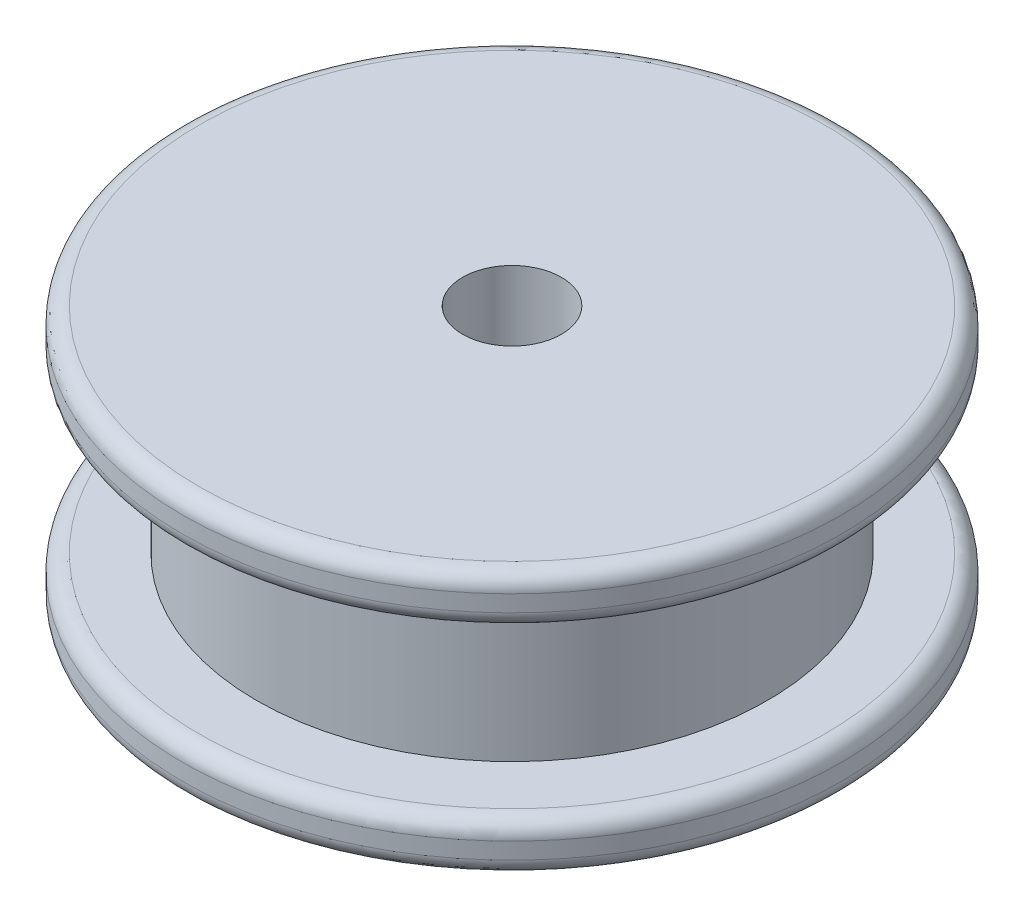
ISO-10303-21;
HEADER;
FILE_DESCRIPTION(('STEP AP214'),'2;1');
FILE_NAME('part.step','',(''),(''),'','','');
FILE_SCHEMA(('AUTOMOTIVE_DESIGN { 1 0 10303 214 1 1 1 1 }'));
ENDSEC;
DATA;
#1=APPLICATION_CONTEXT('core data for automotive mechanical design processes');
#2=APPLICATION_PROTOCOL_DEFINITION('international standard','automotive_design',2000,#1);
#3=PRODUCT_CONTEXT('',#1,'mechanical');
#4=PRODUCT('Part','Part','',(#3));
#5=PRODUCT_RELATED_PRODUCT_CATEGORY('part','',(#4));
#6=PRODUCT_DEFINITION_FORMATION('','',#4);
#7=PRODUCT_DEFINITION_CONTEXT('part definition',#1,'design');
#8=PRODUCT_DEFINITION('design','',#6,#7);
#9=PRODUCT_DEFINITION_SHAPE('','',#8);
#10=(LENGTH_UNIT() NAMED_UNIT(*) SI_UNIT(.MILLI.,.METRE.));
#11=(NAMED_UNIT(*) PLANE_ANGLE_UNIT() SI_UNIT($,.RADIAN.));
#12=(NAMED_UNIT(*) SI_UNIT($,.STERADIAN.) SOLID_ANGLE_UNIT());
#13=UNCERTAINTY_MEASURE_WITH_UNIT(LENGTH_MEASURE(1.E-05),#10,'distance_accuracy_value','');
#14=(GEOMETRIC_REPRESENTATION_CONTEXT(3) GLOBAL_UNCERTAINTY_ASSIGNED_CONTEXT((#13)) GLOBAL_UNIT_ASSIGNED_CONTEXT((#10,
#11,#12)) REPRESENTATION_CONTEXT('',''));
#15=CARTESIAN_POINT('',(0.,0.,0.));
#16=DIRECTION('',(0.,0.,1.));
#17=DIRECTION('',(1.,0.,0.));
#18=AXIS2_PLACEMENT_3D('',#15,#16,#17);
#19=CARTESIAN_POINT('',(0.,10.,0.));
#20=DIRECTION('',(0.,-1.,0.));
#21=DIRECTION('',(0.,0.,-1.));
#22=AXIS2_PLACEMENT_3D('',#19,#20,#21);
#23=CYLINDRICAL_SURFACE('',#22,15.5);
#24=CARTESIAN_POINT('',(0.,10.,0.));
#25=DIRECTION('',(0.,1.,0.));
#26=DIRECTION('',(0.,0.,1.));
#27=AXIS2_PLACEMENT_3D('',#24,#25,#26);
#28=CIRCLE('',#27,15.5);
#29=CARTESIAN_POINT('',(0.,10.,15.5));
#30=VERTEX_POINT('',#29);
#31=EDGE_CURVE('E77',#30,#30,#28,.T.);
#32=ORIENTED_EDGE('',*,*,#31,.F.);
#33=EDGE_LOOP('',(#32));
#34=FACE_BOUND('',#33,.T.);
#35=CARTESIAN_POINT('',(0.,0.,0.));
#36=DIRECTION('',(0.,1.,0.));
#37=DIRECTION('',(0.,0.,1.));
#38=AXIS2_PLACEMENT_3D('',#35,#36,#37);
#39=CIRCLE('',#38,15.5);
#40=CARTESIAN_POINT('',(0.,0.,15.5));
#41=VERTEX_POINT('',#40);
#42=EDGE_CURVE('E78',#41,#41,#39,.T.);
#43=ORIENTED_EDGE('',*,*,#42,.T.);
#44=EDGE_LOOP('',(#43));
#45=FACE_BOUND('',#44,.T.);
#46=ADVANCED_FACE('F37',(#34,#45),#23,.T.);
#47=CARTESIAN_POINT('',(0.,13.,0.));
#48=DIRECTION('',(0.,-1.,0.));
#49=DIRECTION('',(0.,0.,-1.));
#50=AXIS2_PLACEMENT_3D('',#47,#48,#49);
#51=CYLINDRICAL_SURFACE('',#50,20.);
#52=CARTESIAN_POINT('',(0.,11.,0.));
#53=DIRECTION('',(0.,1.,0.));
#54=DIRECTION('',(0.,0.,1.));
#55=AXIS2_PLACEMENT_3D('',#52,#53,#54);
#56=CIRCLE('',#55,20.);
#57=CARTESIAN_POINT('',(0.,11.,20.));
#58=VERTEX_POINT('',#57);
#59=EDGE_CURVE('E50',#58,#58,#56,.T.);
#60=ORIENTED_EDGE('',*,*,#59,.T.);
#61=EDGE_LOOP('',(#60));
#62=FACE_BOUND('',#61,.T.);
#63=CARTESIAN_POINT('',(0.,12.,0.));
#64=DIRECTION('',(0.,1.,0.));
#65=DIRECTION('',(0.,0.,1.));
#66=AXIS2_PLACEMENT_3D('',#63,#64,#65);
#67=CIRCLE('',#66,20.);
#68=CARTESIAN_POINT('',(0.,12.,20.));
#69=VERTEX_POINT('',#68);
#70=EDGE_CURVE('E55',#69,#69,#67,.F.);
#71=ORIENTED_EDGE('',*,*,#70,.T.);
#72=EDGE_LOOP('',(#71));
#73=FACE_BOUND('',#72,.T.);
#74=ADVANCED_FACE('F106',(#62,#73),#51,.T.);
#75=CARTESIAN_POINT('',(0.,13.,0.));
#76=DIRECTION('',(0.,1.,0.));
#77=DIRECTION('',(0.,0.,1.));
#78=AXIS2_PLACEMENT_3D('',#75,#76,#77);
#79=PLANE('',#78);
#80=CARTESIAN_POINT('',(0.,13.,0.));
#81=DIRECTION('',(0.,1.,0.));
#82=DIRECTION('',(0.,0.,1.));
#83=AXIS2_PLACEMENT_3D('',#80,#81,#82);
#84=CIRCLE('',#83,3.);
#85=CARTESIAN_POINT('',(0.,13.,3.));
#86=VERTEX_POINT('',#85);
#87=EDGE_CURVE('E86',#86,#86,#84,.T.);
#88=ORIENTED_EDGE('',*,*,#87,.F.);
#89=EDGE_LOOP('',(#88));
#90=FACE_BOUND('',#89,.T.);
#91=CARTESIAN_POINT('',(0.,13.,0.));
#92=DIRECTION('',(0.,1.,0.));
#93=DIRECTION('',(0.,0.,1.));
#94=AXIS2_PLACEMENT_3D('',#91,#92,#93);
#95=CIRCLE('',#94,19.);
#96=CARTESIAN_POINT('',(0.,13.,19.));
#97=VERTEX_POINT('',#96);
#98=EDGE_CURVE('E10',#97,#97,#95,.T.);
#99=ORIENTED_EDGE('',*,*,#98,.T.);
#100=EDGE_LOOP('',(#99));
#101=FACE_BOUND('',#100,.T.);
#102=ADVANCED_FACE('F103',(#90,#101),#79,.T.);
#103=CARTESIAN_POINT('',(0.,10.,0.));
#104=DIRECTION('',(0.,1.,0.));
#105=DIRECTION('',(0.,0.,1.));
#106=AXIS2_PLACEMENT_3D('',#103,#104,#105);
#107=PLANE('',#106);
#108=CARTESIAN_POINT('',(0.,10.,0.));
#109=DIRECTION('',(0.,1.,0.));
#110=DIRECTION('',(0.,0.,1.));
#111=AXIS2_PLACEMENT_3D('',#108,#109,#110);
#112=CIRCLE('',#111,19.);
#113=CARTESIAN_POINT('',(0.,10.,19.));
#114=VERTEX_POINT('',#113);
#115=EDGE_CURVE('E45',#114,#114,#112,.F.);
#116=ORIENTED_EDGE('',*,*,#115,.T.);
#117=EDGE_LOOP('',(#116));
#118=FACE_BOUND('',#117,.T.);
#119=ORIENTED_EDGE('',*,*,#31,.T.);
#120=EDGE_LOOP('',(#119));
#121=FACE_BOUND('',#120,.T.);
#122=ADVANCED_FACE('F105',(#118,#121),#107,.F.);
#123=CARTESIAN_POINT('',(0.,-3.,0.));
#124=DIRECTION('',(0.,1.,0.));
#125=DIRECTION('',(0.,0.,1.));
#126=AXIS2_PLACEMENT_3D('',#123,#124,#125);
#127=CYLINDRICAL_SURFACE('',#126,20.);
#128=CARTESIAN_POINT('',(0.,-1.,0.));
#129=DIRECTION('',(0.,-1.,0.));
#130=DIRECTION('',(0.,0.,-1.));
#131=AXIS2_PLACEMENT_3D('',#128,#129,#130);
#132=CIRCLE('',#131,20.);
#133=CARTESIAN_POINT('',(0.,-1.,-20.));
#134=VERTEX_POINT('',#133);
#135=EDGE_CURVE('E69',#134,#134,#132,.T.);
#136=ORIENTED_EDGE('',*,*,#135,.T.);
#137=EDGE_LOOP('',(#136));
#138=FACE_BOUND('',#137,.T.);
#139=CARTESIAN_POINT('',(0.,-2.,0.));
#140=DIRECTION('',(0.,-1.,0.));
#141=DIRECTION('',(0.,0.,-1.));
#142=AXIS2_PLACEMENT_3D('',#139,#140,#141);
#143=CIRCLE('',#142,20.);
#144=CARTESIAN_POINT('',(0.,-2.,-20.));
#145=VERTEX_POINT('',#144);
#146=EDGE_CURVE('E73',#145,#145,#143,.F.);
#147=ORIENTED_EDGE('',*,*,#146,.T.);
#148=EDGE_LOOP('',(#147));
#149=FACE_BOUND('',#148,.T.);
#150=ADVANCED_FACE('F112',(#138,#149),#127,.T.);
#151=CARTESIAN_POINT('',(0.,-3.,0.));
#152=DIRECTION('',(0.,-1.,0.));
#153=DIRECTION('',(0.,0.,-1.));
#154=AXIS2_PLACEMENT_3D('',#151,#152,#153);
#155=PLANE('',#154);
#156=CARTESIAN_POINT('',(0.,-3.,0.));
#157=DIRECTION('',(0.,1.,0.));
#158=DIRECTION('',(0.,0.,1.));
#159=AXIS2_PLACEMENT_3D('',#156,#157,#158);
#160=CIRCLE('',#159,3.);
#161=CARTESIAN_POINT('',(0.,-3.,3.));
#162=VERTEX_POINT('',#161);
#163=EDGE_CURVE('E82',#162,#162,#160,.T.);
#164=ORIENTED_EDGE('',*,*,#163,.T.);
#165=EDGE_LOOP('',(#164));
#166=FACE_BOUND('',#165,.T.);
#167=CARTESIAN_POINT('',(0.,-3.,0.));
#168=DIRECTION('',(0.,-1.,0.));
#169=DIRECTION('',(0.,0.,-1.));
#170=AXIS2_PLACEMENT_3D('',#167,#168,#169);
#171=CIRCLE('',#170,19.);
#172=CARTESIAN_POINT('',(0.,-3.,-19.));
#173=VERTEX_POINT('',#172);
#174=EDGE_CURVE('E61',#173,#173,#171,.T.);
#175=ORIENTED_EDGE('',*,*,#174,.T.);
#176=EDGE_LOOP('',(#175));
#177=FACE_BOUND('',#176,.T.);
#178=ADVANCED_FACE('F94',(#166,#177),#155,.T.);
#179=CARTESIAN_POINT('',(0.,0.,0.));
#180=DIRECTION('',(0.,-1.,0.));
#181=DIRECTION('',(0.,0.,-1.));
#182=AXIS2_PLACEMENT_3D('',#179,#180,#181);
#183=PLANE('',#182);
#184=CARTESIAN_POINT('',(0.,0.,0.));
#185=DIRECTION('',(0.,-1.,0.));
#186=DIRECTION('',(0.,0.,-1.));
#187=AXIS2_PLACEMENT_3D('',#184,#185,#186);
#188=CIRCLE('',#187,19.);
#189=CARTESIAN_POINT('',(0.,0.,-19.));
#190=VERTEX_POINT('',#189);
#191=EDGE_CURVE('E65',#190,#190,#188,.F.);
#192=ORIENTED_EDGE('',*,*,#191,.T.);
#193=EDGE_LOOP('',(#192));
#194=FACE_BOUND('',#193,.T.);
#195=ORIENTED_EDGE('',*,*,#42,.F.);
#196=EDGE_LOOP('',(#195));
#197=FACE_BOUND('',#196,.T.);
#198=ADVANCED_FACE('F129',(#194,#197),#183,.F.);
#199=CARTESIAN_POINT('',(0.,-1.,0.));
#200=DIRECTION('',(0.,-1.,0.));
#201=DIRECTION('',(0.,0.,-1.));
#202=AXIS2_PLACEMENT_3D('',#199,#200,#201);
#203=TOROIDAL_SURFACE('',#202,19.,1.);
#204=ORIENTED_EDGE('',*,*,#191,.F.);
#205=EDGE_LOOP('',(#204));
#206=FACE_BOUND('',#205,.T.);
#207=ORIENTED_EDGE('',*,*,#135,.F.);
#208=EDGE_LOOP('',(#207));
#209=FACE_BOUND('',#208,.T.);
#210=ADVANCED_FACE('F125',(#206,#209),#203,.T.);
#211=CARTESIAN_POINT('',(0.,-2.,0.));
#212=DIRECTION('',(0.,-1.,0.));
#213=DIRECTION('',(0.,0.,-1.));
#214=AXIS2_PLACEMENT_3D('',#211,#212,#213);
#215=TOROIDAL_SURFACE('',#214,19.,1.);
#216=ORIENTED_EDGE('',*,*,#146,.F.);
#217=EDGE_LOOP('',(#216));
#218=FACE_BOUND('',#217,.T.);
#219=ORIENTED_EDGE('',*,*,#174,.F.);
#220=EDGE_LOOP('',(#219));
#221=FACE_BOUND('',#220,.T.);
#222=ADVANCED_FACE('F128',(#218,#221),#215,.T.);
#223=CARTESIAN_POINT('',(0.,11.,0.));
#224=DIRECTION('',(0.,1.,0.));
#225=DIRECTION('',(0.,0.,1.));
#226=AXIS2_PLACEMENT_3D('',#223,#224,#225);
#227=TOROIDAL_SURFACE('',#226,19.,1.);
#228=ORIENTED_EDGE('',*,*,#115,.F.);
#229=EDGE_LOOP('',(#228));
#230=FACE_BOUND('',#229,.T.);
#231=ORIENTED_EDGE('',*,*,#59,.F.);
#232=EDGE_LOOP('',(#231));
#233=FACE_BOUND('',#232,.T.);
#234=ADVANCED_FACE('F132',(#230,#233),#227,.T.);
#235=CARTESIAN_POINT('',(0.,12.,0.));
#236=DIRECTION('',(0.,1.,0.));
#237=DIRECTION('',(0.,0.,1.));
#238=AXIS2_PLACEMENT_3D('',#235,#236,#237);
#239=TOROIDAL_SURFACE('',#238,19.,1.);
#240=ORIENTED_EDGE('',*,*,#70,.F.);
#241=EDGE_LOOP('',(#240));
#242=FACE_BOUND('',#241,.T.);
#243=ORIENTED_EDGE('',*,*,#98,.F.);
#244=EDGE_LOOP('',(#243));
#245=FACE_BOUND('',#244,.T.);
#246=ADVANCED_FACE('F39',(#242,#245),#239,.T.);
#247=CARTESIAN_POINT('',(0.,-3.,0.));
#248=DIRECTION('',(0.,1.,0.));
#249=DIRECTION('',(0.,0.,1.));
#250=AXIS2_PLACEMENT_3D('',#247,#248,#249);
#251=CYLINDRICAL_SURFACE('',#250,3.);
#252=ORIENTED_EDGE('',*,*,#163,.F.);
#253=EDGE_LOOP('',(#252));
#254=FACE_BOUND('',#253,.T.);
#255=ORIENTED_EDGE('',*,*,#87,.T.);
#256=EDGE_LOOP('',(#255));
#257=FACE_BOUND('',#256,.T.);
#258=ADVANCED_FACE('F97',(#254,#257),#251,.F.);
#259=CLOSED_SHELL('',(#46,#74,#102,#122,#150,#178,#198,#210,#222,#234,#246,#258));
#260=MANIFOLD_SOLID_BREP('B2',#259);
#261=ADVANCED_BREP_SHAPE_REPRESENTATION('',(#18,#260),#14);
#262=SHAPE_DEFINITION_REPRESENTATION(#9,#261);
ENDSEC;
END-ISO-10303-21;
